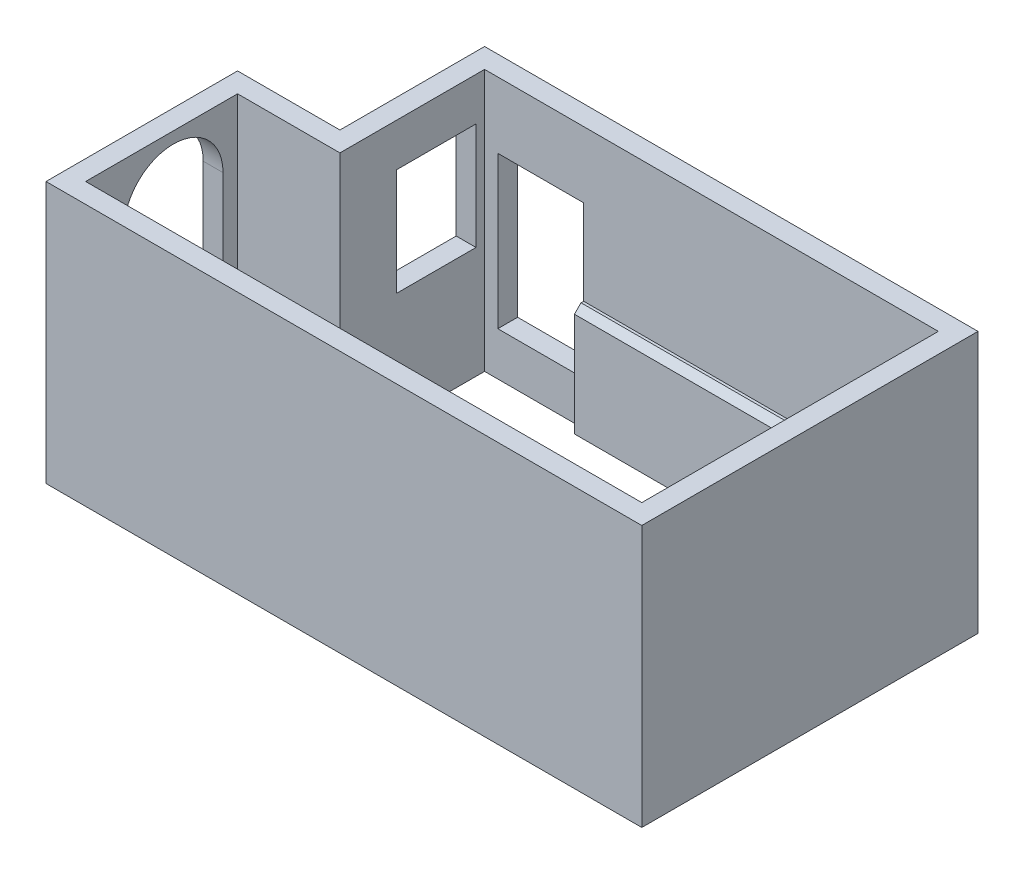
ISO-10303-21;
HEADER;
FILE_DESCRIPTION(('STEP AP214'),'2;1');
FILE_NAME('part.step','',(''),(''),'','','');
FILE_SCHEMA(('AUTOMOTIVE_DESIGN { 1 0 10303 214 1 1 1 1 }'));
ENDSEC;
DATA;
#1=APPLICATION_CONTEXT('core data for automotive mechanical design processes');
#2=APPLICATION_PROTOCOL_DEFINITION('international standard','automotive_design',2000,#1);
#3=PRODUCT_CONTEXT('',#1,'mechanical');
#4=PRODUCT('Part','Part','',(#3));
#5=PRODUCT_RELATED_PRODUCT_CATEGORY('part','',(#4));
#6=PRODUCT_DEFINITION_FORMATION('','',#4);
#7=PRODUCT_DEFINITION_CONTEXT('part definition',#1,'design');
#8=PRODUCT_DEFINITION('design','',#6,#7);
#9=PRODUCT_DEFINITION_SHAPE('','',#8);
#10=(LENGTH_UNIT() NAMED_UNIT(*) SI_UNIT(.MILLI.,.METRE.));
#11=(NAMED_UNIT(*) PLANE_ANGLE_UNIT() SI_UNIT($,.RADIAN.));
#12=(NAMED_UNIT(*) SI_UNIT($,.STERADIAN.) SOLID_ANGLE_UNIT());
#13=UNCERTAINTY_MEASURE_WITH_UNIT(LENGTH_MEASURE(1.E-05),#10,'distance_accuracy_value','');
#14=(GEOMETRIC_REPRESENTATION_CONTEXT(3) GLOBAL_UNCERTAINTY_ASSIGNED_CONTEXT((#13)) GLOBAL_UNIT_ASSIGNED_CONTEXT((#10,
#11,#12)) REPRESENTATION_CONTEXT('',''));
#15=CARTESIAN_POINT('',(0.,0.,0.));
#16=DIRECTION('',(0.,0.,1.));
#17=DIRECTION('',(1.,0.,0.));
#18=AXIS2_PLACEMENT_3D('',#15,#16,#17);
#19=CARTESIAN_POINT('',(7776.35402749019,1670.,-1789.28599467213));
#20=DIRECTION('',(0.,0.707106781186547,0.707106781186547));
#21=DIRECTION('',(-1.,0.,0.));
#22=AXIS2_PLACEMENT_3D('',#19,#20,#21);
#23=PLANE('',#22);
#24=DIRECTION('',(1.,0.,0.));
#25=VECTOR('',#24,1.);
#26=CARTESIAN_POINT('',(2406.3540274902,1670.,-1789.28599467213));
#27=LINE('',#26,#25);
#28=CARTESIAN_POINT('',(2406.3540274902,1670.,-1789.28599467213));
#29=VERTEX_POINT('',#28);
#30=CARTESIAN_POINT('',(7776.35402749019,1670.,-1789.28599467213));
#31=VERTEX_POINT('',#30);
#32=EDGE_CURVE('E420',#29,#31,#27,.T.);
#33=ORIENTED_EDGE('',*,*,#32,.F.);
#34=DIRECTION('',(0.,0.707106781186548,-0.707106781186548));
#35=VECTOR('',#34,1.);
#36=CARTESIAN_POINT('',(2406.35402749019,1670.,-1789.28599467213));
#37=LINE('',#36,#35);
#38=CARTESIAN_POINT('',(2406.3540274902,1570.,-1689.28599467213));
#39=VERTEX_POINT('',#38);
#40=EDGE_CURVE('E45',#39,#29,#37,.T.);
#41=ORIENTED_EDGE('',*,*,#40,.F.);
#42=DIRECTION('',(-1.,0.,0.));
#43=VECTOR('',#42,1.);
#44=CARTESIAN_POINT('',(2406.3540274902,1570.,-1689.28599467213));
#45=LINE('',#44,#43);
#46=CARTESIAN_POINT('',(7776.35402749019,1570.,-1689.28599467213));
#47=VERTEX_POINT('',#46);
#48=EDGE_CURVE('E437',#47,#39,#45,.T.);
#49=ORIENTED_EDGE('',*,*,#48,.F.);
#50=DIRECTION('',(0.,-0.707106781186548,0.707106781186548));
#51=VECTOR('',#50,1.);
#52=CARTESIAN_POINT('',(7776.35402749019,1920.35700266393,-2039.64299733607));
#53=LINE('',#52,#51);
#54=EDGE_CURVE('E13',#47,#31,#53,.F.);
#55=ORIENTED_EDGE('',*,*,#54,.T.);
#56=EDGE_LOOP('',(#33,#41,#49,#55));
#57=FACE_BOUND('',#56,.T.);
#58=ADVANCED_FACE('F38',(#57),#23,.T.);
#59=CARTESIAN_POINT('',(0.,3960.,-1829.28599467213));
#60=DIRECTION('',(0.,0.,-1.));
#61=DIRECTION('',(-1.,0.,0.));
#62=AXIS2_PLACEMENT_3D('',#59,#60,#61);
#63=PLANE('',#62);
#64=DIRECTION('',(-1.,0.,0.));
#65=VECTOR('',#64,1.);
#66=CARTESIAN_POINT('',(7776.35402749019,1670.,-1829.28599467213));
#67=LINE('',#66,#65);
#68=CARTESIAN_POINT('',(7776.35402749019,1670.,-1829.28599467213));
#69=VERTEX_POINT('',#68);
#70=CARTESIAN_POINT('',(2406.3540274902,1670.,-1829.28599467213));
#71=VERTEX_POINT('',#70);
#72=EDGE_CURVE('E283',#69,#71,#67,.T.);
#73=ORIENTED_EDGE('',*,*,#72,.F.);
#74=DIRECTION('',(0.,-1.,0.));
#75=VECTOR('',#74,1.);
#76=CARTESIAN_POINT('',(7776.35402749019,3960.,-1829.28599467213));
#77=LINE('',#76,#75);
#78=CARTESIAN_POINT('',(7776.35402749019,3960.,-1829.28599467213));
#79=VERTEX_POINT('',#78);
#80=EDGE_CURVE('E426',#79,#69,#77,.T.);
#81=ORIENTED_EDGE('',*,*,#80,.F.);
#82=DIRECTION('',(1.,0.,0.));
#83=VECTOR('',#82,1.);
#84=CARTESIAN_POINT('',(0.,3960.,-1829.28599467213));
#85=LINE('',#84,#83);
#86=CARTESIAN_POINT('',(906.354027490195,3960.,-1829.28599467213));
#87=VERTEX_POINT('',#86);
#88=EDGE_CURVE('E351',#87,#79,#85,.T.);
#89=ORIENTED_EDGE('',*,*,#88,.F.);
#90=DIRECTION('',(0.,-1.,0.));
#91=VECTOR('',#90,1.);
#92=CARTESIAN_POINT('',(906.354027490195,3960.,-1829.28599467213));
#93=LINE('',#92,#91);
#94=CARTESIAN_POINT('',(906.354027490195,0.,-1829.28599467213));
#95=VERTEX_POINT('',#94);
#96=EDGE_CURVE('E429',#87,#95,#93,.T.);
#97=ORIENTED_EDGE('',*,*,#96,.T.);
#98=DIRECTION('',(1.,0.,0.));
#99=VECTOR('',#98,1.);
#100=CARTESIAN_POINT('',(0.,0.,-1829.28599467213));
#101=LINE('',#100,#99);
#102=CARTESIAN_POINT('',(2406.3540274902,0.,-1829.28599467213));
#103=VERTEX_POINT('',#102);
#104=EDGE_CURVE('E383',#95,#103,#101,.T.);
#105=ORIENTED_EDGE('',*,*,#104,.T.);
#106=DIRECTION('',(0.,-1.,0.));
#107=VECTOR('',#106,1.);
#108=CARTESIAN_POINT('',(2406.3540274902,1670.,-1829.28599467213));
#109=LINE('',#108,#107);
#110=CARTESIAN_POINT('',(2406.3540274902,660.000000000001,-1829.28599467213));
#111=VERTEX_POINT('',#110);
#112=EDGE_CURVE('E293',#111,#103,#109,.T.);
#113=ORIENTED_EDGE('',*,*,#112,.F.);
#114=DIRECTION('',(1.,0.,0.));
#115=VECTOR('',#114,1.);
#116=CARTESIAN_POINT('',(1106.35402749019,660.,-1829.28599467213));
#117=LINE('',#116,#115);
#118=CARTESIAN_POINT('',(1106.35402749019,660.,-1829.28599467213));
#119=VERTEX_POINT('',#118);
#120=EDGE_CURVE('E324',#119,#111,#117,.T.);
#121=ORIENTED_EDGE('',*,*,#120,.F.);
#122=DIRECTION('',(0.,-1.,0.));
#123=VECTOR('',#122,1.);
#124=CARTESIAN_POINT('',(1106.35402749019,2960.,-1829.28599467213));
#125=LINE('',#124,#123);
#126=CARTESIAN_POINT('',(1106.35402749019,2960.,-1829.28599467213));
#127=VERTEX_POINT('',#126);
#128=EDGE_CURVE('E308',#127,#119,#125,.T.);
#129=ORIENTED_EDGE('',*,*,#128,.F.);
#130=DIRECTION('',(-1.,0.,0.));
#131=VECTOR('',#130,1.);
#132=CARTESIAN_POINT('',(1106.35402749019,2960.,-1829.28599467213));
#133=LINE('',#132,#131);
#134=CARTESIAN_POINT('',(2406.35402749019,2960.,-1829.28599467213));
#135=VERTEX_POINT('',#134);
#136=EDGE_CURVE('E313',#135,#127,#133,.T.);
#137=ORIENTED_EDGE('',*,*,#136,.F.);
#138=DIRECTION('',(0.,1.,0.));
#139=VECTOR('',#138,1.);
#140=CARTESIAN_POINT('',(2406.35402749019,2960.,-1829.28599467213));
#141=LINE('',#140,#139);
#142=EDGE_CURVE('E327',#71,#135,#141,.T.);
#143=ORIENTED_EDGE('',*,*,#142,.F.);
#144=EDGE_LOOP('',(#73,#81,#89,#97,#105,#113,#121,#129,#137,#143));
#145=FACE_BOUND('',#144,.T.);
#146=ADVANCED_FACE('F455',(#145),#63,.F.);
#147=CARTESIAN_POINT('',(7776.35402749019,3960.,0.));
#148=DIRECTION('',(1.,0.,0.));
#149=DIRECTION('',(0.,0.,-1.));
#150=AXIS2_PLACEMENT_3D('',#147,#148,#149);
#151=PLANE('',#150);
#152=DIRECTION('',(0.,0.,-1.));
#153=VECTOR('',#152,1.);
#154=CARTESIAN_POINT('',(7776.35402749019,1670.,-1689.28599467213));
#155=LINE('',#154,#153);
#156=EDGE_CURVE('E306',#31,#69,#155,.T.);
#157=ORIENTED_EDGE('',*,*,#156,.F.);
#158=ORIENTED_EDGE('',*,*,#54,.F.);
#159=DIRECTION('',(0.,1.,0.));
#160=VECTOR('',#159,1.);
#161=CARTESIAN_POINT('',(7776.35402749019,0.,-1689.28599467213));
#162=LINE('',#161,#160);
#163=CARTESIAN_POINT('',(7776.35402749019,0.,-1689.28599467213));
#164=VERTEX_POINT('',#163);
#165=EDGE_CURVE('E292',#164,#47,#162,.T.);
#166=ORIENTED_EDGE('',*,*,#165,.F.);
#167=DIRECTION('',(0.,0.,1.));
#168=VECTOR('',#167,1.);
#169=CARTESIAN_POINT('',(7776.35402749019,0.,0.));
#170=LINE('',#169,#168);
#171=CARTESIAN_POINT('',(7776.3540274902,0.,2660.71400532786));
#172=VERTEX_POINT('',#171);
#173=EDGE_CURVE('E386',#164,#172,#170,.T.);
#174=ORIENTED_EDGE('',*,*,#173,.T.);
#175=DIRECTION('',(0.,-1.,0.));
#176=VECTOR('',#175,1.);
#177=CARTESIAN_POINT('',(7776.3540274902,3960.,2660.71400532786));
#178=LINE('',#177,#176);
#179=CARTESIAN_POINT('',(7776.3540274902,3960.,2660.71400532786));
#180=VERTEX_POINT('',#179);
#181=EDGE_CURVE('E423',#180,#172,#178,.T.);
#182=ORIENTED_EDGE('',*,*,#181,.F.);
#183=DIRECTION('',(0.,0.,1.));
#184=VECTOR('',#183,1.);
#185=CARTESIAN_POINT('',(7776.35402749019,3960.,0.));
#186=LINE('',#185,#184);
#187=EDGE_CURVE('E353',#79,#180,#186,.T.);
#188=ORIENTED_EDGE('',*,*,#187,.F.);
#189=ORIENTED_EDGE('',*,*,#80,.T.);
#190=EDGE_LOOP('',(#157,#158,#166,#174,#182,#188,#189));
#191=FACE_BOUND('',#190,.T.);
#192=ADVANCED_FACE('F481',(#191),#151,.F.);
#193=CARTESIAN_POINT('',(-943.645972509804,3960.,0.));
#194=DIRECTION('',(-1.,0.,0.));
#195=DIRECTION('',(0.,0.,1.));
#196=AXIS2_PLACEMENT_3D('',#193,#194,#195);
#197=PLANE('',#196);
#198=DIRECTION('',(0.,0.,-1.));
#199=VECTOR('',#198,1.);
#200=CARTESIAN_POINT('',(-943.645972509803,1687.21213365235,0.));
#201=LINE('',#200,#199);
#202=CARTESIAN_POINT('',(-943.645972509803,1687.21213365235,2080.71400532786));
#203=VERTEX_POINT('',#202);
#204=CARTESIAN_POINT('',(-943.645972509803,1687.21213365235,580.714005327861));
#205=VERTEX_POINT('',#204);
#206=EDGE_CURVE('E223',#203,#205,#201,.T.);
#207=ORIENTED_EDGE('',*,*,#206,.T.);
#208=DIRECTION('',(0.,1.,0.));
#209=VECTOR('',#208,1.);
#210=CARTESIAN_POINT('',(-943.645972509803,0.,580.714005327861));
#211=LINE('',#210,#209);
#212=CARTESIAN_POINT('',(-943.645972509804,3036.3498082713,580.714005327861));
#213=VERTEX_POINT('',#212);
#214=EDGE_CURVE('E232',#205,#213,#211,.T.);
#215=ORIENTED_EDGE('',*,*,#214,.T.);
#216=CARTESIAN_POINT('',(-943.645972509803,3036.3498082713,1331.57633070892));
#217=DIRECTION('',(1.,0.,0.));
#218=DIRECTION('',(0.,0.,-1.));
#219=AXIS2_PLACEMENT_3D('',#216,#217,#218);
#220=CIRCLE('',#219,750.862325381056);
#221=CARTESIAN_POINT('',(-943.645972509803,2985.48748289024,2080.71400532786));
#222=VERTEX_POINT('',#221);
#223=EDGE_CURVE('E52',#213,#222,#220,.T.);
#224=ORIENTED_EDGE('',*,*,#223,.T.);
#225=DIRECTION('',(0.,-1.,0.));
#226=VECTOR('',#225,1.);
#227=CARTESIAN_POINT('',(-943.645972509803,0.,2080.71400532786));
#228=LINE('',#227,#226);
#229=EDGE_CURVE('E229',#222,#203,#228,.T.);
#230=ORIENTED_EDGE('',*,*,#229,.T.);
#231=EDGE_LOOP('',(#207,#215,#224,#230));
#232=FACE_BOUND('',#231,.T.);
#233=DIRECTION('',(0.,0.,-1.));
#234=VECTOR('',#233,1.);
#235=CARTESIAN_POINT('',(-943.645972509804,0.,0.));
#236=LINE('',#235,#234);
#237=CARTESIAN_POINT('',(-943.645972509804,0.,2960.71400532786));
#238=VERTEX_POINT('',#237);
#239=CARTESIAN_POINT('',(-943.645972509804,0.,60.7140053278613));
#240=VERTEX_POINT('',#239);
#241=EDGE_CURVE('E390',#238,#240,#236,.T.);
#242=ORIENTED_EDGE('',*,*,#241,.F.);
#243=DIRECTION('',(0.,-1.,0.));
#244=VECTOR('',#243,1.);
#245=CARTESIAN_POINT('',(-943.645972509804,3960.,2960.71400532786));
#246=LINE('',#245,#244);
#247=CARTESIAN_POINT('',(-943.645972509804,3960.,2960.71400532786));
#248=VERTEX_POINT('',#247);
#249=EDGE_CURVE('E418',#248,#238,#246,.T.);
#250=ORIENTED_EDGE('',*,*,#249,.F.);
#251=DIRECTION('',(0.,0.,-1.));
#252=VECTOR('',#251,1.);
#253=CARTESIAN_POINT('',(-943.645972509804,3960.,0.));
#254=LINE('',#253,#252);
#255=CARTESIAN_POINT('',(-943.645972509804,3960.,60.7140053278613));
#256=VERTEX_POINT('',#255);
#257=EDGE_CURVE('E357',#248,#256,#254,.T.);
#258=ORIENTED_EDGE('',*,*,#257,.T.);
#259=DIRECTION('',(0.,-1.,0.));
#260=VECTOR('',#259,1.);
#261=CARTESIAN_POINT('',(-943.645972509804,3960.,60.7140053278613));
#262=LINE('',#261,#260);
#263=EDGE_CURVE('E407',#256,#240,#262,.T.);
#264=ORIENTED_EDGE('',*,*,#263,.T.);
#265=EDGE_LOOP('',(#242,#250,#258,#264));
#266=FACE_BOUND('',#265,.T.);
#267=ADVANCED_FACE('F236',(#232,#266),#197,.T.);
#268=CARTESIAN_POINT('',(4.52346723584196E-13,3960.,2960.71400532786));
#269=DIRECTION('',(0.,0.,1.));
#270=DIRECTION('',(1.,0.,0.));
#271=AXIS2_PLACEMENT_3D('',#268,#269,#270);
#272=PLANE('',#271);
#273=DIRECTION('',(-1.,0.,0.));
#274=VECTOR('',#273,1.);
#275=CARTESIAN_POINT('',(4.52346723584196E-13,0.,2960.71400532786));
#276=LINE('',#275,#274);
#277=CARTESIAN_POINT('',(8076.3540274902,0.,2960.71400532786));
#278=VERTEX_POINT('',#277);
#279=EDGE_CURVE('E393',#278,#238,#276,.T.);
#280=ORIENTED_EDGE('',*,*,#279,.F.);
#281=DIRECTION('',(0.,-1.,0.));
#282=VECTOR('',#281,1.);
#283=CARTESIAN_POINT('',(8076.3540274902,3960.,2960.71400532786));
#284=LINE('',#283,#282);
#285=CARTESIAN_POINT('',(8076.3540274902,3960.,2960.71400532786));
#286=VERTEX_POINT('',#285);
#287=EDGE_CURVE('E416',#286,#278,#284,.T.);
#288=ORIENTED_EDGE('',*,*,#287,.F.);
#289=DIRECTION('',(-1.,0.,0.));
#290=VECTOR('',#289,1.);
#291=CARTESIAN_POINT('',(4.52346723584196E-13,3960.,2960.71400532786));
#292=LINE('',#291,#290);
#293=EDGE_CURVE('E360',#286,#248,#292,.T.);
#294=ORIENTED_EDGE('',*,*,#293,.T.);
#295=ORIENTED_EDGE('',*,*,#249,.T.);
#296=EDGE_LOOP('',(#280,#288,#294,#295));
#297=FACE_BOUND('',#296,.T.);
#298=ADVANCED_FACE('F589',(#297),#272,.T.);
#299=CARTESIAN_POINT('',(8076.3540274902,3960.,0.));
#300=DIRECTION('',(1.,0.,0.));
#301=DIRECTION('',(0.,0.,-1.));
#302=AXIS2_PLACEMENT_3D('',#299,#300,#301);
#303=PLANE('',#302);
#304=DIRECTION('',(0.,0.,1.));
#305=VECTOR('',#304,1.);
#306=CARTESIAN_POINT('',(8076.3540274902,0.,0.));
#307=LINE('',#306,#305);
#308=CARTESIAN_POINT('',(8076.3540274902,0.,-2129.28599467213));
#309=VERTEX_POINT('',#308);
#310=EDGE_CURVE('E396',#309,#278,#307,.T.);
#311=ORIENTED_EDGE('',*,*,#310,.F.);
#312=DIRECTION('',(0.,-1.,0.));
#313=VECTOR('',#312,1.);
#314=CARTESIAN_POINT('',(8076.3540274902,3960.,-2129.28599467213));
#315=LINE('',#314,#313);
#316=CARTESIAN_POINT('',(8076.3540274902,3960.,-2129.28599467213));
#317=VERTEX_POINT('',#316);
#318=EDGE_CURVE('E414',#317,#309,#315,.T.);
#319=ORIENTED_EDGE('',*,*,#318,.F.);
#320=DIRECTION('',(0.,0.,1.));
#321=VECTOR('',#320,1.);
#322=CARTESIAN_POINT('',(8076.3540274902,3960.,0.));
#323=LINE('',#322,#321);
#324=EDGE_CURVE('E363',#317,#286,#323,.T.);
#325=ORIENTED_EDGE('',*,*,#324,.T.);
#326=ORIENTED_EDGE('',*,*,#287,.T.);
#327=EDGE_LOOP('',(#311,#319,#325,#326));
#328=FACE_BOUND('',#327,.T.);
#329=ADVANCED_FACE('F586',(#328),#303,.T.);
#330=CARTESIAN_POINT('',(0.,3960.,-2129.28599467213));
#331=DIRECTION('',(0.,0.,-1.));
#332=DIRECTION('',(-1.,0.,0.));
#333=AXIS2_PLACEMENT_3D('',#330,#331,#332);
#334=PLANE('',#333);
#335=DIRECTION('',(0.,-1.,0.));
#336=VECTOR('',#335,1.);
#337=CARTESIAN_POINT('',(1106.35402749019,2960.,-2129.28599467213));
#338=LINE('',#337,#336);
#339=CARTESIAN_POINT('',(1106.35402749019,2960.,-2129.28599467213));
#340=VERTEX_POINT('',#339);
#341=CARTESIAN_POINT('',(1106.35402749019,660.,-2129.28599467213));
#342=VERTEX_POINT('',#341);
#343=EDGE_CURVE('E309',#340,#342,#338,.T.);
#344=ORIENTED_EDGE('',*,*,#343,.T.);
#345=DIRECTION('',(1.,0.,0.));
#346=VECTOR('',#345,1.);
#347=CARTESIAN_POINT('',(1106.35402749019,660.,-2129.28599467213));
#348=LINE('',#347,#346);
#349=CARTESIAN_POINT('',(2406.3540274902,660.,-2129.28599467213));
#350=VERTEX_POINT('',#349);
#351=EDGE_CURVE('E312',#342,#350,#348,.T.);
#352=ORIENTED_EDGE('',*,*,#351,.T.);
#353=DIRECTION('',(0.,1.,0.));
#354=VECTOR('',#353,1.);
#355=CARTESIAN_POINT('',(2406.35402749019,2960.,-2129.28599467213));
#356=LINE('',#355,#354);
#357=CARTESIAN_POINT('',(2406.35402749019,2960.,-2129.28599467213));
#358=VERTEX_POINT('',#357);
#359=EDGE_CURVE('E316',#350,#358,#356,.T.);
#360=ORIENTED_EDGE('',*,*,#359,.T.);
#361=DIRECTION('',(-1.,0.,0.));
#362=VECTOR('',#361,1.);
#363=CARTESIAN_POINT('',(1106.35402749019,2960.,-2129.28599467213));
#364=LINE('',#363,#362);
#365=EDGE_CURVE('E319',#358,#340,#364,.T.);
#366=ORIENTED_EDGE('',*,*,#365,.T.);
#367=EDGE_LOOP('',(#344,#352,#360,#366));
#368=FACE_BOUND('',#367,.T.);
#369=DIRECTION('',(1.,0.,0.));
#370=VECTOR('',#369,1.);
#371=CARTESIAN_POINT('',(0.,0.,-2129.28599467213));
#372=LINE('',#371,#370);
#373=CARTESIAN_POINT('',(606.354027490195,0.,-2129.28599467213));
#374=VERTEX_POINT('',#373);
#375=EDGE_CURVE('E399',#374,#309,#372,.T.);
#376=ORIENTED_EDGE('',*,*,#375,.F.);
#377=DIRECTION('',(0.,-1.,0.));
#378=VECTOR('',#377,1.);
#379=CARTESIAN_POINT('',(606.354027490195,3960.,-2129.28599467213));
#380=LINE('',#379,#378);
#381=CARTESIAN_POINT('',(606.354027490195,3960.,-2129.28599467213));
#382=VERTEX_POINT('',#381);
#383=EDGE_CURVE('E412',#382,#374,#380,.T.);
#384=ORIENTED_EDGE('',*,*,#383,.F.);
#385=DIRECTION('',(1.,0.,0.));
#386=VECTOR('',#385,1.);
#387=CARTESIAN_POINT('',(0.,3960.,-2129.28599467213));
#388=LINE('',#387,#386);
#389=EDGE_CURVE('E366',#382,#317,#388,.T.);
#390=ORIENTED_EDGE('',*,*,#389,.T.);
#391=ORIENTED_EDGE('',*,*,#318,.T.);
#392=EDGE_LOOP('',(#376,#384,#390,#391));
#393=FACE_BOUND('',#392,.T.);
#394=ADVANCED_FACE('F462',(#368,#393),#334,.T.);
#395=CARTESIAN_POINT('',(606.354027490195,3960.,0.));
#396=DIRECTION('',(1.,0.,0.));
#397=DIRECTION('',(0.,0.,-1.));
#398=AXIS2_PLACEMENT_3D('',#395,#396,#397);
#399=PLANE('',#398);
#400=DIRECTION('',(0.,0.,1.));
#401=VECTOR('',#400,1.);
#402=CARTESIAN_POINT('',(606.354027490195,3310.,-499.285994672134));
#403=LINE('',#402,#401);
#404=CARTESIAN_POINT('',(606.354027490195,3310.,-1699.28599467213));
#405=VERTEX_POINT('',#404);
#406=CARTESIAN_POINT('',(606.354027490195,3310.,-499.285994672134));
#407=VERTEX_POINT('',#406);
#408=EDGE_CURVE('E268',#405,#407,#403,.T.);
#409=ORIENTED_EDGE('',*,*,#408,.T.);
#410=DIRECTION('',(0.,-1.,0.));
#411=VECTOR('',#410,1.);
#412=CARTESIAN_POINT('',(606.354027490195,3310.,-499.285994672134));
#413=LINE('',#412,#411);
#414=CARTESIAN_POINT('',(606.354027490195,1690.,-499.285994672134));
#415=VERTEX_POINT('',#414);
#416=EDGE_CURVE('E258',#407,#415,#413,.T.);
#417=ORIENTED_EDGE('',*,*,#416,.T.);
#418=DIRECTION('',(0.,0.,-1.));
#419=VECTOR('',#418,1.);
#420=CARTESIAN_POINT('',(606.354027490195,1690.,-499.285994672134));
#421=LINE('',#420,#419);
#422=CARTESIAN_POINT('',(606.354027490195,1690.,-1699.28599467213));
#423=VERTEX_POINT('',#422);
#424=EDGE_CURVE('E261',#415,#423,#421,.T.);
#425=ORIENTED_EDGE('',*,*,#424,.T.);
#426=DIRECTION('',(0.,1.,0.));
#427=VECTOR('',#426,1.);
#428=CARTESIAN_POINT('',(606.354027490195,3310.,-1699.28599467213));
#429=LINE('',#428,#427);
#430=EDGE_CURVE('E265',#423,#405,#429,.T.);
#431=ORIENTED_EDGE('',*,*,#430,.T.);
#432=EDGE_LOOP('',(#409,#417,#425,#431));
#433=FACE_BOUND('',#432,.T.);
#434=DIRECTION('',(0.,0.,1.));
#435=VECTOR('',#434,1.);
#436=CARTESIAN_POINT('',(606.354027490195,0.,0.));
#437=LINE('',#436,#435);
#438=CARTESIAN_POINT('',(606.354027490195,0.,60.7140053278613));
#439=VERTEX_POINT('',#438);
#440=EDGE_CURVE('E402',#374,#439,#437,.T.);
#441=ORIENTED_EDGE('',*,*,#440,.T.);
#442=DIRECTION('',(0.,-1.,0.));
#443=VECTOR('',#442,1.);
#444=CARTESIAN_POINT('',(606.354027490195,3960.,60.7140053278613));
#445=LINE('',#444,#443);
#446=CARTESIAN_POINT('',(606.354027490195,3960.,60.7140053278613));
#447=VERTEX_POINT('',#446);
#448=EDGE_CURVE('E409',#447,#439,#445,.T.);
#449=ORIENTED_EDGE('',*,*,#448,.F.);
#450=DIRECTION('',(0.,0.,1.));
#451=VECTOR('',#450,1.);
#452=CARTESIAN_POINT('',(606.354027490195,3960.,0.));
#453=LINE('',#452,#451);
#454=EDGE_CURVE('E369',#382,#447,#453,.T.);
#455=ORIENTED_EDGE('',*,*,#454,.F.);
#456=ORIENTED_EDGE('',*,*,#383,.T.);
#457=EDGE_LOOP('',(#441,#449,#455,#456));
#458=FACE_BOUND('',#457,.T.);
#459=ADVANCED_FACE('F527',(#433,#458),#399,.F.);
#460=CARTESIAN_POINT('',(-643.645972509803,3960.,0.));
#461=DIRECTION('',(-1.,0.,0.));
#462=DIRECTION('',(0.,0.,1.));
#463=AXIS2_PLACEMENT_3D('',#460,#461,#462);
#464=PLANE('',#463);
#465=DIRECTION('',(0.,1.,0.));
#466=VECTOR('',#465,1.);
#467=CARTESIAN_POINT('',(-643.645972509803,0.,580.714005327861));
#468=LINE('',#467,#466);
#469=CARTESIAN_POINT('',(-643.645972509803,1687.21213365235,580.714005327861));
#470=VERTEX_POINT('',#469);
#471=CARTESIAN_POINT('',(-643.645972509803,3036.3498082713,580.714005327861));
#472=VERTEX_POINT('',#471);
#473=EDGE_CURVE('E248',#470,#472,#468,.T.);
#474=ORIENTED_EDGE('',*,*,#473,.F.);
#475=DIRECTION('',(0.,0.,-1.));
#476=VECTOR('',#475,1.);
#477=CARTESIAN_POINT('',(-643.645972509803,1687.21213365235,0.));
#478=LINE('',#477,#476);
#479=CARTESIAN_POINT('',(-643.645972509803,1687.21213365235,2080.71400532786));
#480=VERTEX_POINT('',#479);
#481=EDGE_CURVE('E60',#480,#470,#478,.T.);
#482=ORIENTED_EDGE('',*,*,#481,.F.);
#483=DIRECTION('',(0.,-1.,0.));
#484=VECTOR('',#483,1.);
#485=CARTESIAN_POINT('',(-643.645972509803,0.,2080.71400532786));
#486=LINE('',#485,#484);
#487=CARTESIAN_POINT('',(-643.645972509803,2985.48748289024,2080.71400532786));
#488=VERTEX_POINT('',#487);
#489=EDGE_CURVE('E239',#488,#480,#486,.T.);
#490=ORIENTED_EDGE('',*,*,#489,.F.);
#491=CARTESIAN_POINT('',(-643.645972509803,3036.3498082713,1331.57633070892));
#492=DIRECTION('',(1.,0.,0.));
#493=DIRECTION('',(0.,0.,-1.));
#494=AXIS2_PLACEMENT_3D('',#491,#492,#493);
#495=CIRCLE('',#494,750.862325381056);
#496=EDGE_CURVE('E242',#472,#488,#495,.T.);
#497=ORIENTED_EDGE('',*,*,#496,.F.);
#498=EDGE_LOOP('',(#474,#482,#490,#497));
#499=FACE_BOUND('',#498,.T.);
#500=DIRECTION('',(0.,0.,-1.));
#501=VECTOR('',#500,1.);
#502=CARTESIAN_POINT('',(-643.645972509803,0.,0.));
#503=LINE('',#502,#501);
#504=CARTESIAN_POINT('',(-643.645972509803,0.,2660.71400532786));
#505=VERTEX_POINT('',#504);
#506=CARTESIAN_POINT('',(-643.645972509804,0.,360.714005327861));
#507=VERTEX_POINT('',#506);
#508=EDGE_CURVE('E333',#505,#507,#503,.T.);
#509=ORIENTED_EDGE('',*,*,#508,.T.);
#510=DIRECTION('',(0.,-1.,0.));
#511=VECTOR('',#510,1.);
#512=CARTESIAN_POINT('',(-643.645972509804,3960.,360.714005327861));
#513=LINE('',#512,#511);
#514=CARTESIAN_POINT('',(-643.645972509804,3960.,360.714005327861));
#515=VERTEX_POINT('',#514);
#516=EDGE_CURVE('E410',#515,#507,#513,.T.);
#517=ORIENTED_EDGE('',*,*,#516,.F.);
#518=DIRECTION('',(0.,0.,-1.));
#519=VECTOR('',#518,1.);
#520=CARTESIAN_POINT('',(-643.645972509803,3960.,0.));
#521=LINE('',#520,#519);
#522=CARTESIAN_POINT('',(-643.645972509803,3960.,2660.71400532786));
#523=VERTEX_POINT('',#522);
#524=EDGE_CURVE('E342',#523,#515,#521,.T.);
#525=ORIENTED_EDGE('',*,*,#524,.F.);
#526=DIRECTION('',(0.,-1.,0.));
#527=VECTOR('',#526,1.);
#528=CARTESIAN_POINT('',(-643.645972509803,3960.,2660.71400532786));
#529=LINE('',#528,#527);
#530=EDGE_CURVE('E374',#523,#505,#529,.T.);
#531=ORIENTED_EDGE('',*,*,#530,.T.);
#532=EDGE_LOOP('',(#509,#517,#525,#531));
#533=FACE_BOUND('',#532,.T.);
#534=ADVANCED_FACE('F498',(#499,#533),#464,.F.);
#535=CARTESIAN_POINT('',(0.,3960.,360.714005327861));
#536=DIRECTION('',(0.,0.,-1.));
#537=DIRECTION('',(-1.,0.,0.));
#538=AXIS2_PLACEMENT_3D('',#535,#536,#537);
#539=PLANE('',#538);
#540=DIRECTION('',(1.,0.,0.));
#541=VECTOR('',#540,1.);
#542=CARTESIAN_POINT('',(0.,0.,360.714005327861));
#543=LINE('',#542,#541);
#544=CARTESIAN_POINT('',(906.354027490196,0.,360.714005327861));
#545=VERTEX_POINT('',#544);
#546=EDGE_CURVE('E377',#507,#545,#543,.T.);
#547=ORIENTED_EDGE('',*,*,#546,.T.);
#548=DIRECTION('',(0.,-1.,0.));
#549=VECTOR('',#548,1.);
#550=CARTESIAN_POINT('',(906.354027490196,3960.,360.714005327861));
#551=LINE('',#550,#549);
#552=CARTESIAN_POINT('',(906.354027490196,3960.,360.714005327861));
#553=VERTEX_POINT('',#552);
#554=EDGE_CURVE('E431',#553,#545,#551,.T.);
#555=ORIENTED_EDGE('',*,*,#554,.F.);
#556=DIRECTION('',(1.,0.,0.));
#557=VECTOR('',#556,1.);
#558=CARTESIAN_POINT('',(0.,3960.,360.714005327861));
#559=LINE('',#558,#557);
#560=EDGE_CURVE('E345',#515,#553,#559,.T.);
#561=ORIENTED_EDGE('',*,*,#560,.F.);
#562=ORIENTED_EDGE('',*,*,#516,.T.);
#563=EDGE_LOOP('',(#547,#555,#561,#562));
#564=FACE_BOUND('',#563,.T.);
#565=ADVANCED_FACE('F495',(#564),#539,.F.);
#566=CARTESIAN_POINT('',(906.354027490196,3960.,-3.21634053354773E-13));
#567=DIRECTION('',(1.,0.,0.));
#568=DIRECTION('',(0.,0.,-1.));
#569=AXIS2_PLACEMENT_3D('',#566,#567,#568);
#570=PLANE('',#569);
#571=DIRECTION('',(0.,-1.,0.));
#572=VECTOR('',#571,1.);
#573=CARTESIAN_POINT('',(906.354027490195,3310.,-499.285994672134));
#574=LINE('',#573,#572);
#575=CARTESIAN_POINT('',(906.354027490195,3310.,-499.285994672134));
#576=VERTEX_POINT('',#575);
#577=CARTESIAN_POINT('',(906.354027490195,1690.,-499.285994672134));
#578=VERTEX_POINT('',#577);
#579=EDGE_CURVE('E254',#576,#578,#574,.T.);
#580=ORIENTED_EDGE('',*,*,#579,.F.);
#581=DIRECTION('',(0.,0.,1.));
#582=VECTOR('',#581,1.);
#583=CARTESIAN_POINT('',(906.354027490195,3310.,-499.285994672134));
#584=LINE('',#583,#582);
#585=CARTESIAN_POINT('',(906.354027490195,3310.,-1699.28599467213));
#586=VERTEX_POINT('',#585);
#587=EDGE_CURVE('E262',#586,#576,#584,.T.);
#588=ORIENTED_EDGE('',*,*,#587,.F.);
#589=DIRECTION('',(0.,1.,0.));
#590=VECTOR('',#589,1.);
#591=CARTESIAN_POINT('',(906.354027490195,3310.,-1699.28599467213));
#592=LINE('',#591,#590);
#593=CARTESIAN_POINT('',(906.354027490195,1690.,-1699.28599467213));
#594=VERTEX_POINT('',#593);
#595=EDGE_CURVE('E276',#594,#586,#592,.T.);
#596=ORIENTED_EDGE('',*,*,#595,.F.);
#597=DIRECTION('',(0.,0.,-1.));
#598=VECTOR('',#597,1.);
#599=CARTESIAN_POINT('',(906.354027490195,1690.,-499.285994672134));
#600=LINE('',#599,#598);
#601=EDGE_CURVE('E273',#578,#594,#600,.T.);
#602=ORIENTED_EDGE('',*,*,#601,.F.);
#603=EDGE_LOOP('',(#580,#588,#596,#602));
#604=FACE_BOUND('',#603,.T.);
#605=DIRECTION('',(0.,0.,1.));
#606=VECTOR('',#605,1.);
#607=CARTESIAN_POINT('',(906.354027490196,0.,-3.21634053354773E-13));
#608=LINE('',#607,#606);
#609=EDGE_CURVE('E380',#95,#545,#608,.T.);
#610=ORIENTED_EDGE('',*,*,#609,.F.);
#611=ORIENTED_EDGE('',*,*,#96,.F.);
#612=DIRECTION('',(0.,0.,1.));
#613=VECTOR('',#612,1.);
#614=CARTESIAN_POINT('',(906.354027490196,3960.,-3.21634053354773E-13));
#615=LINE('',#614,#613);
#616=EDGE_CURVE('E348',#87,#553,#615,.T.);
#617=ORIENTED_EDGE('',*,*,#616,.T.);
#618=ORIENTED_EDGE('',*,*,#554,.T.);
#619=EDGE_LOOP('',(#610,#611,#617,#618));
#620=FACE_BOUND('',#619,.T.);
#621=ADVANCED_FACE('F491',(#604,#620),#570,.T.);
#622=CARTESIAN_POINT('',(0.,3960.,2660.71400532786));
#623=DIRECTION('',(0.,0.,1.));
#624=DIRECTION('',(1.,0.,0.));
#625=AXIS2_PLACEMENT_3D('',#622,#623,#624);
#626=PLANE('',#625);
#627=DIRECTION('',(-1.,0.,0.));
#628=VECTOR('',#627,1.);
#629=CARTESIAN_POINT('',(0.,0.,2660.71400532786));
#630=LINE('',#629,#628);
#631=EDGE_CURVE('E388',#172,#505,#630,.T.);
#632=ORIENTED_EDGE('',*,*,#631,.T.);
#633=ORIENTED_EDGE('',*,*,#530,.F.);
#634=DIRECTION('',(-1.,0.,0.));
#635=VECTOR('',#634,1.);
#636=CARTESIAN_POINT('',(0.,3960.,2660.71400532786));
#637=LINE('',#636,#635);
#638=EDGE_CURVE('E355',#180,#523,#637,.T.);
#639=ORIENTED_EDGE('',*,*,#638,.F.);
#640=ORIENTED_EDGE('',*,*,#181,.T.);
#641=EDGE_LOOP('',(#632,#633,#639,#640));
#642=FACE_BOUND('',#641,.T.);
#643=ADVANCED_FACE('F502',(#642),#626,.F.);
#644=CARTESIAN_POINT('',(0.,3960.,60.7140053278613));
#645=DIRECTION('',(0.,0.,-1.));
#646=DIRECTION('',(-1.,0.,0.));
#647=AXIS2_PLACEMENT_3D('',#644,#645,#646);
#648=PLANE('',#647);
#649=DIRECTION('',(1.,0.,0.));
#650=VECTOR('',#649,1.);
#651=CARTESIAN_POINT('',(0.,0.,60.7140053278613));
#652=LINE('',#651,#650);
#653=EDGE_CURVE('E346',#240,#439,#652,.T.);
#654=ORIENTED_EDGE('',*,*,#653,.F.);
#655=ORIENTED_EDGE('',*,*,#263,.F.);
#656=DIRECTION('',(1.,0.,0.));
#657=VECTOR('',#656,1.);
#658=CARTESIAN_POINT('',(0.,3960.,60.7140053278613));
#659=LINE('',#658,#657);
#660=EDGE_CURVE('E371',#256,#447,#659,.T.);
#661=ORIENTED_EDGE('',*,*,#660,.T.);
#662=ORIENTED_EDGE('',*,*,#448,.T.);
#663=EDGE_LOOP('',(#654,#655,#661,#662));
#664=FACE_BOUND('',#663,.T.);
#665=ADVANCED_FACE('F504',(#664),#648,.T.);
#666=CARTESIAN_POINT('',(0.,3960.,0.));
#667=DIRECTION('',(0.,1.,0.));
#668=DIRECTION('',(0.,0.,1.));
#669=AXIS2_PLACEMENT_3D('',#666,#667,#668);
#670=PLANE('',#669);
#671=ORIENTED_EDGE('',*,*,#524,.T.);
#672=ORIENTED_EDGE('',*,*,#560,.T.);
#673=ORIENTED_EDGE('',*,*,#616,.F.);
#674=ORIENTED_EDGE('',*,*,#88,.T.);
#675=ORIENTED_EDGE('',*,*,#187,.T.);
#676=ORIENTED_EDGE('',*,*,#638,.T.);
#677=EDGE_LOOP('',(#671,#672,#673,#674,#675,#676));
#678=FACE_BOUND('',#677,.T.);
#679=ORIENTED_EDGE('',*,*,#257,.F.);
#680=ORIENTED_EDGE('',*,*,#293,.F.);
#681=ORIENTED_EDGE('',*,*,#324,.F.);
#682=ORIENTED_EDGE('',*,*,#389,.F.);
#683=ORIENTED_EDGE('',*,*,#454,.T.);
#684=ORIENTED_EDGE('',*,*,#660,.F.);
#685=EDGE_LOOP('',(#679,#680,#681,#682,#683,#684));
#686=FACE_BOUND('',#685,.T.);
#687=ADVANCED_FACE('F487',(#678,#686),#670,.T.);
#688=CARTESIAN_POINT('',(0.,0.,0.));
#689=DIRECTION('',(0.,1.,0.));
#690=DIRECTION('',(0.,0.,1.));
#691=AXIS2_PLACEMENT_3D('',#688,#689,#690);
#692=PLANE('',#691);
#693=ORIENTED_EDGE('',*,*,#173,.F.);
#694=DIRECTION('',(1.,0.,0.));
#695=VECTOR('',#694,1.);
#696=CARTESIAN_POINT('',(2406.3540274902,0.,-1689.28599467213));
#697=LINE('',#696,#695);
#698=CARTESIAN_POINT('',(2406.3540274902,0.,-1689.28599467213));
#699=VERTEX_POINT('',#698);
#700=EDGE_CURVE('E290',#699,#164,#697,.T.);
#701=ORIENTED_EDGE('',*,*,#700,.F.);
#702=DIRECTION('',(0.,0.,-1.));
#703=VECTOR('',#702,1.);
#704=CARTESIAN_POINT('',(2406.3540274902,0.,-1689.28599467213));
#705=LINE('',#704,#703);
#706=EDGE_CURVE('E298',#699,#103,#705,.T.);
#707=ORIENTED_EDGE('',*,*,#706,.T.);
#708=ORIENTED_EDGE('',*,*,#104,.F.);
#709=ORIENTED_EDGE('',*,*,#609,.T.);
#710=ORIENTED_EDGE('',*,*,#546,.F.);
#711=ORIENTED_EDGE('',*,*,#508,.F.);
#712=ORIENTED_EDGE('',*,*,#631,.F.);
#713=EDGE_LOOP('',(#693,#701,#707,#708,#709,#710,#711,#712));
#714=FACE_BOUND('',#713,.T.);
#715=ORIENTED_EDGE('',*,*,#241,.T.);
#716=ORIENTED_EDGE('',*,*,#653,.T.);
#717=ORIENTED_EDGE('',*,*,#440,.F.);
#718=ORIENTED_EDGE('',*,*,#375,.T.);
#719=ORIENTED_EDGE('',*,*,#310,.T.);
#720=ORIENTED_EDGE('',*,*,#279,.T.);
#721=EDGE_LOOP('',(#715,#716,#717,#718,#719,#720));
#722=FACE_BOUND('',#721,.T.);
#723=ADVANCED_FACE('F473',(#714,#722),#692,.F.);
#724=CARTESIAN_POINT('',(1106.35402749019,2960.,-2129.28599467213));
#725=DIRECTION('',(-1.,0.,0.));
#726=DIRECTION('',(0.,-1.,0.));
#727=AXIS2_PLACEMENT_3D('',#724,#725,#726);
#728=PLANE('',#727);
#729=ORIENTED_EDGE('',*,*,#128,.T.);
#730=DIRECTION('',(0.,0.,1.));
#731=VECTOR('',#730,1.);
#732=CARTESIAN_POINT('',(1106.35402749019,660.,-2129.28599467213));
#733=LINE('',#732,#731);
#734=EDGE_CURVE('E322',#342,#119,#733,.T.);
#735=ORIENTED_EDGE('',*,*,#734,.F.);
#736=ORIENTED_EDGE('',*,*,#343,.F.);
#737=DIRECTION('',(0.,0.,1.));
#738=VECTOR('',#737,1.);
#739=CARTESIAN_POINT('',(1106.35402749019,2960.,-2129.28599467213));
#740=LINE('',#739,#738);
#741=EDGE_CURVE('E331',#340,#127,#740,.T.);
#742=ORIENTED_EDGE('',*,*,#741,.T.);
#743=EDGE_LOOP('',(#729,#735,#736,#742));
#744=FACE_BOUND('',#743,.T.);
#745=ADVANCED_FACE('F572',(#744),#728,.F.);
#746=CARTESIAN_POINT('',(1106.35402749019,2960.,-2129.28599467213));
#747=DIRECTION('',(0.,1.,0.));
#748=DIRECTION('',(0.,0.,1.));
#749=AXIS2_PLACEMENT_3D('',#746,#747,#748);
#750=PLANE('',#749);
#751=ORIENTED_EDGE('',*,*,#136,.T.);
#752=ORIENTED_EDGE('',*,*,#741,.F.);
#753=ORIENTED_EDGE('',*,*,#365,.F.);
#754=DIRECTION('',(0.,0.,1.));
#755=VECTOR('',#754,1.);
#756=CARTESIAN_POINT('',(2406.35402749019,2960.,-2129.28599467213));
#757=LINE('',#756,#755);
#758=EDGE_CURVE('E334',#358,#135,#757,.T.);
#759=ORIENTED_EDGE('',*,*,#758,.T.);
#760=EDGE_LOOP('',(#751,#752,#753,#759));
#761=FACE_BOUND('',#760,.T.);
#762=ADVANCED_FACE('F459',(#761),#750,.F.);
#763=CARTESIAN_POINT('',(2406.35402749019,2960.,-2129.28599467213));
#764=DIRECTION('',(1.,0.,0.));
#765=DIRECTION('',(0.,1.,0.));
#766=AXIS2_PLACEMENT_3D('',#763,#764,#765);
#767=PLANE('',#766);
#768=DIRECTION('',(0.,-1.,0.));
#769=VECTOR('',#768,1.);
#770=CARTESIAN_POINT('',(2406.3540274902,1670.,-1689.28599467213));
#771=LINE('',#770,#769);
#772=EDGE_CURVE('E296',#39,#699,#771,.T.);
#773=ORIENTED_EDGE('',*,*,#772,.F.);
#774=ORIENTED_EDGE('',*,*,#40,.T.);
#775=DIRECTION('',(0.,0.,-1.));
#776=VECTOR('',#775,1.);
#777=CARTESIAN_POINT('',(2406.3540274902,1670.,-1689.28599467213));
#778=LINE('',#777,#776);
#779=EDGE_CURVE('E304',#29,#71,#778,.T.);
#780=ORIENTED_EDGE('',*,*,#779,.T.);
#781=ORIENTED_EDGE('',*,*,#142,.T.);
#782=ORIENTED_EDGE('',*,*,#758,.F.);
#783=ORIENTED_EDGE('',*,*,#359,.F.);
#784=DIRECTION('',(0.,0.,1.));
#785=VECTOR('',#784,1.);
#786=CARTESIAN_POINT('',(2406.3540274902,660.000000000001,-2129.28599467213));
#787=LINE('',#786,#785);
#788=EDGE_CURVE('E337',#350,#111,#787,.T.);
#789=ORIENTED_EDGE('',*,*,#788,.T.);
#790=ORIENTED_EDGE('',*,*,#112,.T.);
#791=ORIENTED_EDGE('',*,*,#706,.F.);
#792=EDGE_LOOP('',(#773,#774,#780,#781,#782,#783,#789,#790,#791));
#793=FACE_BOUND('',#792,.T.);
#794=ADVANCED_FACE('F442',(#793),#767,.F.);
#795=CARTESIAN_POINT('',(1106.35402749019,660.,-2129.28599467213));
#796=DIRECTION('',(0.,-1.,0.));
#797=DIRECTION('',(1.,0.,0.));
#798=AXIS2_PLACEMENT_3D('',#795,#796,#797);
#799=PLANE('',#798);
#800=ORIENTED_EDGE('',*,*,#120,.T.);
#801=ORIENTED_EDGE('',*,*,#788,.F.);
#802=ORIENTED_EDGE('',*,*,#351,.F.);
#803=ORIENTED_EDGE('',*,*,#734,.T.);
#804=EDGE_LOOP('',(#800,#801,#802,#803));
#805=FACE_BOUND('',#804,.T.);
#806=ADVANCED_FACE('F467',(#805),#799,.F.);
#807=CARTESIAN_POINT('',(7776.35402749019,1670.,-1689.28599467213));
#808=DIRECTION('',(0.,-1.,0.));
#809=DIRECTION('',(0.,0.,-1.));
#810=AXIS2_PLACEMENT_3D('',#807,#808,#809);
#811=PLANE('',#810);
#812=ORIENTED_EDGE('',*,*,#779,.F.);
#813=ORIENTED_EDGE('',*,*,#32,.T.);
#814=ORIENTED_EDGE('',*,*,#156,.T.);
#815=ORIENTED_EDGE('',*,*,#72,.T.);
#816=EDGE_LOOP('',(#812,#813,#814,#815));
#817=FACE_BOUND('',#816,.T.);
#818=ADVANCED_FACE('F449',(#817),#811,.F.);
#819=CARTESIAN_POINT('',(0.,0.,-1689.28599467213));
#820=DIRECTION('',(0.,0.,1.));
#821=DIRECTION('',(1.,0.,0.));
#822=AXIS2_PLACEMENT_3D('',#819,#820,#821);
#823=PLANE('',#822);
#824=ORIENTED_EDGE('',*,*,#165,.T.);
#825=ORIENTED_EDGE('',*,*,#48,.T.);
#826=ORIENTED_EDGE('',*,*,#772,.T.);
#827=ORIENTED_EDGE('',*,*,#700,.T.);
#828=EDGE_LOOP('',(#824,#825,#826,#827));
#829=FACE_BOUND('',#828,.T.);
#830=ADVANCED_FACE('F479',(#829),#823,.T.);
#831=CARTESIAN_POINT('',(606.354027490195,3310.,-499.285994672134));
#832=DIRECTION('',(0.,0.,1.));
#833=DIRECTION('',(1.,0.,0.));
#834=AXIS2_PLACEMENT_3D('',#831,#832,#833);
#835=PLANE('',#834);
#836=ORIENTED_EDGE('',*,*,#579,.T.);
#837=DIRECTION('',(1.,0.,0.));
#838=VECTOR('',#837,1.);
#839=CARTESIAN_POINT('',(606.354027490195,1690.,-499.285994672134));
#840=LINE('',#839,#838);
#841=EDGE_CURVE('E271',#415,#578,#840,.T.);
#842=ORIENTED_EDGE('',*,*,#841,.F.);
#843=ORIENTED_EDGE('',*,*,#416,.F.);
#844=DIRECTION('',(1.,0.,0.));
#845=VECTOR('',#844,1.);
#846=CARTESIAN_POINT('',(606.354027490195,3310.,-499.285994672134));
#847=LINE('',#846,#845);
#848=EDGE_CURVE('E281',#407,#576,#847,.T.);
#849=ORIENTED_EDGE('',*,*,#848,.T.);
#850=EDGE_LOOP('',(#836,#842,#843,#849));
#851=FACE_BOUND('',#850,.T.);
#852=ADVANCED_FACE('F555',(#851),#835,.F.);
#853=CARTESIAN_POINT('',(606.354027490195,3310.,-499.285994672134));
#854=DIRECTION('',(0.,1.,0.));
#855=DIRECTION('',(0.,0.,1.));
#856=AXIS2_PLACEMENT_3D('',#853,#854,#855);
#857=PLANE('',#856);
#858=ORIENTED_EDGE('',*,*,#587,.T.);
#859=ORIENTED_EDGE('',*,*,#848,.F.);
#860=ORIENTED_EDGE('',*,*,#408,.F.);
#861=DIRECTION('',(1.,0.,0.));
#862=VECTOR('',#861,1.);
#863=CARTESIAN_POINT('',(606.354027490195,3310.,-1699.28599467213));
#864=LINE('',#863,#862);
#865=EDGE_CURVE('E284',#405,#586,#864,.T.);
#866=ORIENTED_EDGE('',*,*,#865,.T.);
#867=EDGE_LOOP('',(#858,#859,#860,#866));
#868=FACE_BOUND('',#867,.T.);
#869=ADVANCED_FACE('F551',(#868),#857,.F.);
#870=CARTESIAN_POINT('',(606.354027490195,3310.,-1699.28599467213));
#871=DIRECTION('',(0.,0.,-1.));
#872=DIRECTION('',(-1.,0.,0.));
#873=AXIS2_PLACEMENT_3D('',#870,#871,#872);
#874=PLANE('',#873);
#875=ORIENTED_EDGE('',*,*,#595,.T.);
#876=ORIENTED_EDGE('',*,*,#865,.F.);
#877=ORIENTED_EDGE('',*,*,#430,.F.);
#878=DIRECTION('',(1.,0.,0.));
#879=VECTOR('',#878,1.);
#880=CARTESIAN_POINT('',(606.354027490195,1690.,-1699.28599467213));
#881=LINE('',#880,#879);
#882=EDGE_CURVE('E286',#423,#594,#881,.T.);
#883=ORIENTED_EDGE('',*,*,#882,.T.);
#884=EDGE_LOOP('',(#875,#876,#877,#883));
#885=FACE_BOUND('',#884,.T.);
#886=ADVANCED_FACE('F554',(#885),#874,.F.);
#887=CARTESIAN_POINT('',(606.354027490195,1690.,-499.285994672134));
#888=DIRECTION('',(0.,-1.,0.));
#889=DIRECTION('',(0.,0.,-1.));
#890=AXIS2_PLACEMENT_3D('',#887,#888,#889);
#891=PLANE('',#890);
#892=ORIENTED_EDGE('',*,*,#601,.T.);
#893=ORIENTED_EDGE('',*,*,#882,.F.);
#894=ORIENTED_EDGE('',*,*,#424,.F.);
#895=ORIENTED_EDGE('',*,*,#841,.T.);
#896=EDGE_LOOP('',(#892,#893,#894,#895));
#897=FACE_BOUND('',#896,.T.);
#898=ADVANCED_FACE('F546',(#897),#891,.F.);
#899=CARTESIAN_POINT('',(-943.645972509803,1687.21213365235,0.));
#900=DIRECTION('',(0.,-1.,0.));
#901=DIRECTION('',(0.,0.,-1.));
#902=AXIS2_PLACEMENT_3D('',#899,#900,#901);
#903=PLANE('',#902);
#904=ORIENTED_EDGE('',*,*,#481,.T.);
#905=DIRECTION('',(1.,0.,0.));
#906=VECTOR('',#905,1.);
#907=CARTESIAN_POINT('',(-943.645972509803,1687.21213365235,580.714005327861));
#908=LINE('',#907,#906);
#909=EDGE_CURVE('E219',#205,#470,#908,.T.);
#910=ORIENTED_EDGE('',*,*,#909,.F.);
#911=ORIENTED_EDGE('',*,*,#206,.F.);
#912=DIRECTION('',(1.,0.,0.));
#913=VECTOR('',#912,1.);
#914=CARTESIAN_POINT('',(-943.645972509803,1687.21213365235,2080.71400532786));
#915=LINE('',#914,#913);
#916=EDGE_CURVE('E252',#203,#480,#915,.T.);
#917=ORIENTED_EDGE('',*,*,#916,.T.);
#918=EDGE_LOOP('',(#904,#910,#911,#917));
#919=FACE_BOUND('',#918,.T.);
#920=ADVANCED_FACE('F221',(#919),#903,.F.);
#921=CARTESIAN_POINT('',(-943.645972509803,0.,2080.71400532786));
#922=DIRECTION('',(0.,0.,1.));
#923=DIRECTION('',(1.,0.,0.));
#924=AXIS2_PLACEMENT_3D('',#921,#922,#923);
#925=PLANE('',#924);
#926=ORIENTED_EDGE('',*,*,#489,.T.);
#927=ORIENTED_EDGE('',*,*,#916,.F.);
#928=ORIENTED_EDGE('',*,*,#229,.F.);
#929=DIRECTION('',(1.,0.,0.));
#930=VECTOR('',#929,1.);
#931=CARTESIAN_POINT('',(-943.645972509803,2985.48748289024,2080.71400532786));
#932=LINE('',#931,#930);
#933=EDGE_CURVE('E255',#222,#488,#932,.T.);
#934=ORIENTED_EDGE('',*,*,#933,.T.);
#935=EDGE_LOOP('',(#926,#927,#928,#934));
#936=FACE_BOUND('',#935,.T.);
#937=ADVANCED_FACE('F538',(#936),#925,.F.);
#938=CARTESIAN_POINT('',(-943.645972509803,3036.3498082713,1331.57633070892));
#939=DIRECTION('',(1.,0.,0.));
#940=DIRECTION('',(0.,0.,-1.));
#941=AXIS2_PLACEMENT_3D('',#938,#939,#940);
#942=CYLINDRICAL_SURFACE('',#941,750.862325381056);
#943=ORIENTED_EDGE('',*,*,#496,.T.);
#944=ORIENTED_EDGE('',*,*,#933,.F.);
#945=ORIENTED_EDGE('',*,*,#223,.F.);
#946=DIRECTION('',(1.,0.,0.));
#947=VECTOR('',#946,1.);
#948=CARTESIAN_POINT('',(-943.645972509803,3036.3498082713,580.714005327861));
#949=LINE('',#948,#947);
#950=EDGE_CURVE('E228',#213,#472,#949,.T.);
#951=ORIENTED_EDGE('',*,*,#950,.T.);
#952=EDGE_LOOP('',(#943,#944,#945,#951));
#953=FACE_BOUND('',#952,.T.);
#954=ADVANCED_FACE('F536',(#953),#942,.F.);
#955=CARTESIAN_POINT('',(-943.645972509803,0.,580.714005327861));
#956=DIRECTION('',(0.,0.,-1.));
#957=DIRECTION('',(0.,1.,0.));
#958=AXIS2_PLACEMENT_3D('',#955,#956,#957);
#959=PLANE('',#958);
#960=ORIENTED_EDGE('',*,*,#473,.T.);
#961=ORIENTED_EDGE('',*,*,#950,.F.);
#962=ORIENTED_EDGE('',*,*,#214,.F.);
#963=ORIENTED_EDGE('',*,*,#909,.T.);
#964=EDGE_LOOP('',(#960,#961,#962,#963));
#965=FACE_BOUND('',#964,.T.);
#966=ADVANCED_FACE('F233',(#965),#959,.F.);
#967=CLOSED_SHELL('',(#58,#146,#192,#267,#298,#329,#394,#459,#534,#565,#621,#643,#665,#687,#723,
#745,#762,#794,#806,#818,#830,#852,#869,#886,#898,#920,#937,#954,#966));
#968=MANIFOLD_SOLID_BREP('B2',#967);
#969=ADVANCED_BREP_SHAPE_REPRESENTATION('',(#18,#968),#14);
#970=SHAPE_DEFINITION_REPRESENTATION(#9,#969);
ENDSEC;
END-ISO-10303-21;
